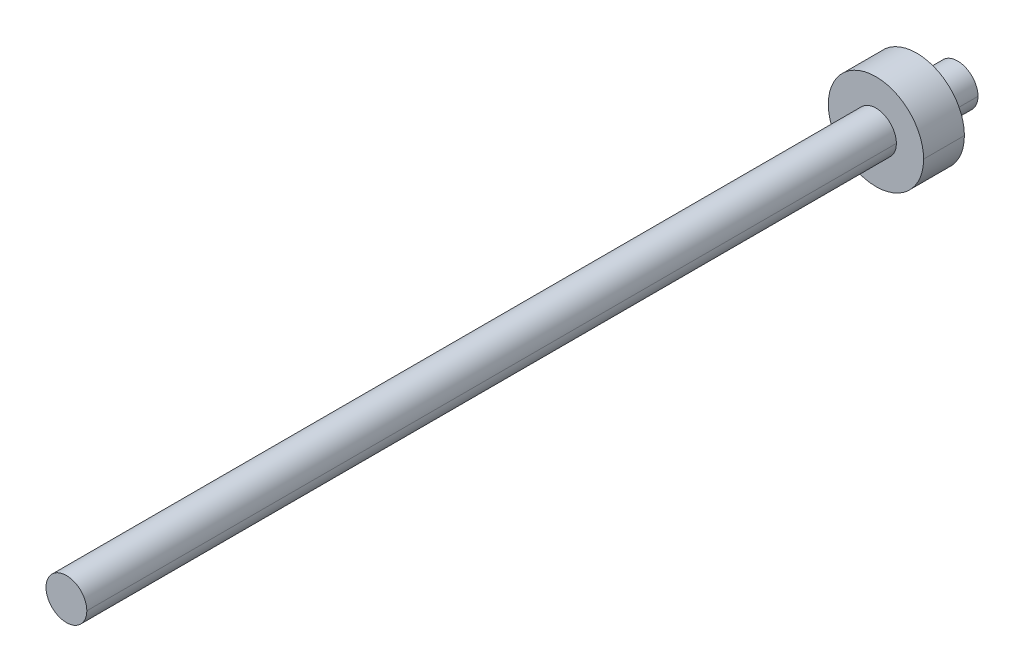
ISO-10303-21;
HEADER;
FILE_DESCRIPTION(('STEP AP214'),'2;1');
FILE_NAME('part.step','',(''),(''),'','','');
FILE_SCHEMA(('AUTOMOTIVE_DESIGN { 1 0 10303 214 1 1 1 1 }'));
ENDSEC;
DATA;
#1=APPLICATION_CONTEXT('core data for automotive mechanical design processes');
#2=APPLICATION_PROTOCOL_DEFINITION('international standard','automotive_design',2000,#1);
#3=PRODUCT_CONTEXT('',#1,'mechanical');
#4=PRODUCT('Part','Part','',(#3));
#5=PRODUCT_RELATED_PRODUCT_CATEGORY('part','',(#4));
#6=PRODUCT_DEFINITION_FORMATION('','',#4);
#7=PRODUCT_DEFINITION_CONTEXT('part definition',#1,'design');
#8=PRODUCT_DEFINITION('design','',#6,#7);
#9=PRODUCT_DEFINITION_SHAPE('','',#8);
#10=(LENGTH_UNIT() NAMED_UNIT(*) SI_UNIT(.MILLI.,.METRE.));
#11=(NAMED_UNIT(*) PLANE_ANGLE_UNIT() SI_UNIT($,.RADIAN.));
#12=(NAMED_UNIT(*) SI_UNIT($,.STERADIAN.) SOLID_ANGLE_UNIT());
#13=UNCERTAINTY_MEASURE_WITH_UNIT(LENGTH_MEASURE(1.E-05),#10,'distance_accuracy_value','');
#14=(GEOMETRIC_REPRESENTATION_CONTEXT(3) GLOBAL_UNCERTAINTY_ASSIGNED_CONTEXT((#13)) GLOBAL_UNIT_ASSIGNED_CONTEXT((#10,
#11,#12)) REPRESENTATION_CONTEXT('',''));
#15=CARTESIAN_POINT('',(0.,0.,0.));
#16=DIRECTION('',(0.,0.,1.));
#17=DIRECTION('',(1.,0.,0.));
#18=AXIS2_PLACEMENT_3D('',#15,#16,#17);
#19=CARTESIAN_POINT('',(0.,0.,11.9));
#20=DIRECTION('',(0.,0.,1.));
#21=DIRECTION('',(1.,0.,0.));
#22=AXIS2_PLACEMENT_3D('',#19,#20,#21);
#23=PLANE('',#22);
#24=CARTESIAN_POINT('',(0.,0.,11.9));
#25=DIRECTION('',(0.,0.,1.));
#26=DIRECTION('',(1.,0.,0.));
#27=AXIS2_PLACEMENT_3D('',#24,#25,#26);
#28=CIRCLE('',#27,0.3);
#29=CARTESIAN_POINT('',(0.3,0.,11.9));
#30=VERTEX_POINT('',#29);
#31=CARTESIAN_POINT('',(-0.3,0.,11.9));
#32=VERTEX_POINT('',#31);
#33=EDGE_CURVE('P0_E60',#30,#32,#28,.T.);
#34=ORIENTED_EDGE('',*,*,#33,.T.);
#35=CARTESIAN_POINT('',(0.,0.,11.9));
#36=DIRECTION('',(0.,0.,1.));
#37=DIRECTION('',(1.,0.,0.));
#38=AXIS2_PLACEMENT_3D('',#35,#36,#37);
#39=CIRCLE('',#38,0.3);
#40=EDGE_CURVE('P0_E11',#32,#30,#39,.T.);
#41=ORIENTED_EDGE('',*,*,#40,.T.);
#42=EDGE_LOOP('',(#34,#41));
#43=FACE_BOUND('',#42,.T.);
#44=ADVANCED_FACE('P0_F17',(#43),#23,.T.);
#45=CARTESIAN_POINT('',(0.,0.,-1.2));
#46=DIRECTION('',(0.,0.,1.));
#47=DIRECTION('',(1.,0.,0.));
#48=AXIS2_PLACEMENT_3D('',#45,#46,#47);
#49=PLANE('',#48);
#50=CARTESIAN_POINT('',(0.,0.,-1.2));
#51=DIRECTION('',(0.,0.,1.));
#52=DIRECTION('',(1.,0.,0.));
#53=AXIS2_PLACEMENT_3D('',#50,#51,#52);
#54=CIRCLE('',#53,0.3);
#55=CARTESIAN_POINT('',(0.3,0.,-1.2));
#56=VERTEX_POINT('',#55);
#57=CARTESIAN_POINT('',(-0.3,0.,-1.2));
#58=VERTEX_POINT('',#57);
#59=EDGE_CURVE('P0_E59',#56,#58,#54,.T.);
#60=ORIENTED_EDGE('',*,*,#59,.F.);
#61=CARTESIAN_POINT('',(0.,0.,-1.2));
#62=DIRECTION('',(0.,0.,1.));
#63=DIRECTION('',(1.,0.,0.));
#64=AXIS2_PLACEMENT_3D('',#61,#62,#63);
#65=CIRCLE('',#64,0.3);
#66=EDGE_CURVE('P0_E26',#58,#56,#65,.T.);
#67=ORIENTED_EDGE('',*,*,#66,.F.);
#68=EDGE_LOOP('',(#60,#67));
#69=FACE_BOUND('',#68,.T.);
#70=ADVANCED_FACE('P0_F63',(#69),#49,.F.);
#71=CARTESIAN_POINT('',(0.,0.,-1.2));
#72=DIRECTION('',(0.,0.,1.));
#73=DIRECTION('',(1.,0.,0.));
#74=AXIS2_PLACEMENT_3D('',#71,#72,#73);
#75=CYLINDRICAL_SURFACE('',#74,0.3);
#76=DIRECTION('',(0.,0.,1.));
#77=VECTOR('',#76,1.);
#78=CARTESIAN_POINT('',(-0.3,0.,-1.2));
#79=LINE('',#78,#77);
#80=EDGE_CURVE('P0_E52',#58,#32,#79,.T.);
#81=ORIENTED_EDGE('',*,*,#80,.F.);
#82=ORIENTED_EDGE('',*,*,#66,.T.);
#83=DIRECTION('',(0.,0.,1.));
#84=VECTOR('',#83,1.);
#85=CARTESIAN_POINT('',(0.3,0.,-1.2));
#86=LINE('',#85,#84);
#87=EDGE_CURVE('P0_E49',#56,#30,#86,.T.);
#88=ORIENTED_EDGE('',*,*,#87,.T.);
#89=ORIENTED_EDGE('',*,*,#40,.F.);
#90=EDGE_LOOP('',(#81,#82,#88,#89));
#91=FACE_BOUND('',#90,.T.);
#92=ADVANCED_FACE('P0_F48',(#91),#75,.T.);
#93=CARTESIAN_POINT('',(0.,0.,-1.2));
#94=DIRECTION('',(0.,0.,1.));
#95=DIRECTION('',(1.,0.,0.));
#96=AXIS2_PLACEMENT_3D('',#93,#94,#95);
#97=CYLINDRICAL_SURFACE('',#96,0.3);
#98=ORIENTED_EDGE('',*,*,#59,.T.);
#99=ORIENTED_EDGE('',*,*,#80,.T.);
#100=ORIENTED_EDGE('',*,*,#33,.F.);
#101=ORIENTED_EDGE('',*,*,#87,.F.);
#102=EDGE_LOOP('',(#98,#99,#100,#101));
#103=FACE_BOUND('',#102,.T.);
#104=ADVANCED_FACE('P0_F58',(#103),#97,.T.);
#105=CLOSED_SHELL('',(#44,#70,#92,#104));
#106=MANIFOLD_SOLID_BREP('P0_B1',#105);
#107=CARTESIAN_POINT('',(0.,0.,0.));
#108=DIRECTION('',(0.,0.,1.));
#109=DIRECTION('',(1.,0.,0.));
#110=AXIS2_PLACEMENT_3D('',#107,#108,#109);
#111=PLANE('',#110);
#112=CARTESIAN_POINT('',(0.,0.,0.));
#113=DIRECTION('',(0.,0.,1.));
#114=DIRECTION('',(1.,0.,0.));
#115=AXIS2_PLACEMENT_3D('',#112,#113,#114);
#116=CIRCLE('',#115,0.7);
#117=CARTESIAN_POINT('',(0.7,0.,0.));
#118=VERTEX_POINT('',#117);
#119=CARTESIAN_POINT('',(-0.7,0.,0.));
#120=VERTEX_POINT('',#119);
#121=EDGE_CURVE('P1_E83',#118,#120,#116,.T.);
#122=ORIENTED_EDGE('',*,*,#121,.T.);
#123=CARTESIAN_POINT('',(0.,0.,0.));
#124=DIRECTION('',(0.,0.,1.));
#125=DIRECTION('',(1.,0.,0.));
#126=AXIS2_PLACEMENT_3D('',#123,#124,#125);
#127=CIRCLE('',#126,0.7);
#128=EDGE_CURVE('P1_E11',#120,#118,#127,.T.);
#129=ORIENTED_EDGE('',*,*,#128,.T.);
#130=EDGE_LOOP('',(#122,#129));
#131=FACE_BOUND('',#130,.T.);
#132=CARTESIAN_POINT('',(0.,0.,0.));
#133=DIRECTION('',(0.,0.,1.));
#134=DIRECTION('',(1.,0.,0.));
#135=AXIS2_PLACEMENT_3D('',#132,#133,#134);
#136=CIRCLE('',#135,0.3);
#137=CARTESIAN_POINT('',(0.3,0.,0.));
#138=VERTEX_POINT('',#137);
#139=CARTESIAN_POINT('',(-0.3,0.,0.));
#140=VERTEX_POINT('',#139);
#141=EDGE_CURVE('P1_E36',#138,#140,#136,.T.);
#142=ORIENTED_EDGE('',*,*,#141,.F.);
#143=CARTESIAN_POINT('',(0.,0.,0.));
#144=DIRECTION('',(0.,0.,1.));
#145=DIRECTION('',(1.,0.,0.));
#146=AXIS2_PLACEMENT_3D('',#143,#144,#145);
#147=CIRCLE('',#146,0.3);
#148=EDGE_CURVE('P1_E106',#140,#138,#147,.T.);
#149=ORIENTED_EDGE('',*,*,#148,.F.);
#150=EDGE_LOOP('',(#142,#149));
#151=FACE_BOUND('',#150,.T.);
#152=ADVANCED_FACE('P1_F17',(#131,#151),#111,.T.);
#153=CARTESIAN_POINT('',(0.,0.,-0.6));
#154=DIRECTION('',(0.,0.,1.));
#155=DIRECTION('',(1.,0.,0.));
#156=AXIS2_PLACEMENT_3D('',#153,#154,#155);
#157=PLANE('',#156);
#158=CARTESIAN_POINT('',(0.,0.,-0.6));
#159=DIRECTION('',(0.,0.,1.));
#160=DIRECTION('',(1.,0.,0.));
#161=AXIS2_PLACEMENT_3D('',#158,#159,#160);
#162=CIRCLE('',#161,0.7);
#163=CARTESIAN_POINT('',(0.7,0.,-0.6));
#164=VERTEX_POINT('',#163);
#165=CARTESIAN_POINT('',(-0.7,0.,-0.6));
#166=VERTEX_POINT('',#165);
#167=EDGE_CURVE('P1_E81',#164,#166,#162,.T.);
#168=ORIENTED_EDGE('',*,*,#167,.F.);
#169=CARTESIAN_POINT('',(0.,0.,-0.6));
#170=DIRECTION('',(0.,0.,1.));
#171=DIRECTION('',(1.,0.,0.));
#172=AXIS2_PLACEMENT_3D('',#169,#170,#171);
#173=CIRCLE('',#172,0.7);
#174=EDGE_CURVE('P1_E25',#166,#164,#173,.T.);
#175=ORIENTED_EDGE('',*,*,#174,.F.);
#176=EDGE_LOOP('',(#168,#175));
#177=FACE_BOUND('',#176,.T.);
#178=CARTESIAN_POINT('',(0.,0.,-0.6));
#179=DIRECTION('',(0.,0.,1.));
#180=DIRECTION('',(1.,0.,0.));
#181=AXIS2_PLACEMENT_3D('',#178,#179,#180);
#182=CIRCLE('',#181,0.3);
#183=CARTESIAN_POINT('',(0.3,0.,-0.6));
#184=VERTEX_POINT('',#183);
#185=CARTESIAN_POINT('',(-0.3,0.,-0.6));
#186=VERTEX_POINT('',#185);
#187=EDGE_CURVE('P1_E103',#184,#186,#182,.T.);
#188=ORIENTED_EDGE('',*,*,#187,.T.);
#189=CARTESIAN_POINT('',(0.,0.,-0.6));
#190=DIRECTION('',(0.,0.,1.));
#191=DIRECTION('',(1.,0.,0.));
#192=AXIS2_PLACEMENT_3D('',#189,#190,#191);
#193=CIRCLE('',#192,0.3);
#194=EDGE_CURVE('P1_E85',#186,#184,#193,.T.);
#195=ORIENTED_EDGE('',*,*,#194,.T.);
#196=EDGE_LOOP('',(#188,#195));
#197=FACE_BOUND('',#196,.T.);
#198=ADVANCED_FACE('P1_F87',(#177,#197),#157,.F.);
#199=CARTESIAN_POINT('',(0.,0.,-0.6));
#200=DIRECTION('',(0.,0.,1.));
#201=DIRECTION('',(1.,0.,0.));
#202=AXIS2_PLACEMENT_3D('',#199,#200,#201);
#203=CYLINDRICAL_SURFACE('',#202,0.7);
#204=DIRECTION('',(0.,0.,1.));
#205=VECTOR('',#204,1.);
#206=CARTESIAN_POINT('',(-0.7,0.,-0.6));
#207=LINE('',#206,#205);
#208=EDGE_CURVE('P1_E74',#166,#120,#207,.T.);
#209=ORIENTED_EDGE('',*,*,#208,.F.);
#210=ORIENTED_EDGE('',*,*,#174,.T.);
#211=DIRECTION('',(0.,0.,1.));
#212=VECTOR('',#211,1.);
#213=CARTESIAN_POINT('',(0.7,0.,-0.6));
#214=LINE('',#213,#212);
#215=EDGE_CURVE('P1_E71',#164,#118,#214,.T.);
#216=ORIENTED_EDGE('',*,*,#215,.T.);
#217=ORIENTED_EDGE('',*,*,#128,.F.);
#218=EDGE_LOOP('',(#209,#210,#216,#217));
#219=FACE_BOUND('',#218,.T.);
#220=ADVANCED_FACE('P1_F70',(#219),#203,.T.);
#221=CARTESIAN_POINT('',(0.,0.,-0.6));
#222=DIRECTION('',(0.,0.,1.));
#223=DIRECTION('',(1.,0.,0.));
#224=AXIS2_PLACEMENT_3D('',#221,#222,#223);
#225=CYLINDRICAL_SURFACE('',#224,0.3);
#226=DIRECTION('',(0.,0.,1.));
#227=VECTOR('',#226,1.);
#228=CARTESIAN_POINT('',(-0.3,0.,-0.6));
#229=LINE('',#228,#227);
#230=EDGE_CURVE('P1_E99',#186,#140,#229,.T.);
#231=ORIENTED_EDGE('',*,*,#230,.F.);
#232=ORIENTED_EDGE('',*,*,#187,.F.);
#233=DIRECTION('',(0.,0.,1.));
#234=VECTOR('',#233,1.);
#235=CARTESIAN_POINT('',(0.3,0.,-0.6));
#236=LINE('',#235,#234);
#237=EDGE_CURVE('P1_E110',#184,#138,#236,.T.);
#238=ORIENTED_EDGE('',*,*,#237,.T.);
#239=ORIENTED_EDGE('',*,*,#141,.T.);
#240=EDGE_LOOP('',(#231,#232,#238,#239));
#241=FACE_BOUND('',#240,.T.);
#242=ADVANCED_FACE('P1_F121',(#241),#225,.F.);
#243=CARTESIAN_POINT('',(0.,0.,-0.6));
#244=DIRECTION('',(0.,0.,1.));
#245=DIRECTION('',(1.,0.,0.));
#246=AXIS2_PLACEMENT_3D('',#243,#244,#245);
#247=CYLINDRICAL_SURFACE('',#246,0.3);
#248=ORIENTED_EDGE('',*,*,#194,.F.);
#249=ORIENTED_EDGE('',*,*,#230,.T.);
#250=ORIENTED_EDGE('',*,*,#148,.T.);
#251=ORIENTED_EDGE('',*,*,#237,.F.);
#252=EDGE_LOOP('',(#248,#249,#250,#251));
#253=FACE_BOUND('',#252,.T.);
#254=ADVANCED_FACE('P1_F123',(#253),#247,.F.);
#255=CARTESIAN_POINT('',(0.,0.,-0.6));
#256=DIRECTION('',(0.,0.,1.));
#257=DIRECTION('',(1.,0.,0.));
#258=AXIS2_PLACEMENT_3D('',#255,#256,#257);
#259=CYLINDRICAL_SURFACE('',#258,0.7);
#260=ORIENTED_EDGE('',*,*,#167,.T.);
#261=ORIENTED_EDGE('',*,*,#208,.T.);
#262=ORIENTED_EDGE('',*,*,#121,.F.);
#263=ORIENTED_EDGE('',*,*,#215,.F.);
#264=EDGE_LOOP('',(#260,#261,#262,#263));
#265=FACE_BOUND('',#264,.T.);
#266=ADVANCED_FACE('P1_F80',(#265),#259,.T.);
#267=CLOSED_SHELL('',(#152,#198,#220,#242,#254,#266));
#268=MANIFOLD_SOLID_BREP('P1_B1',#267);
#269=ADVANCED_BREP_SHAPE_REPRESENTATION('',(#18,#106,#268),#14);
#270=SHAPE_DEFINITION_REPRESENTATION(#9,#269);
ENDSEC;
END-ISO-10303-21;
